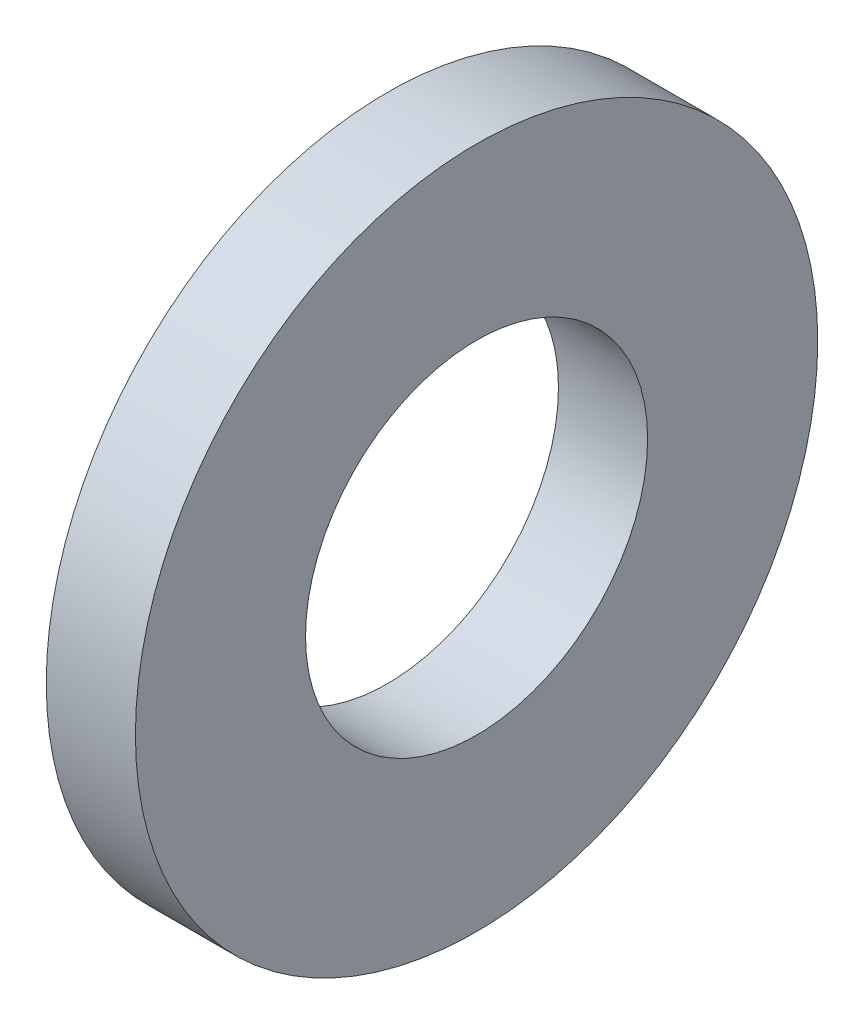
ISO-10303-21;
HEADER;
FILE_DESCRIPTION(('STEP AP214'),'2;1');
FILE_NAME('part.step','',(''),(''),'','','');
FILE_SCHEMA(('AUTOMOTIVE_DESIGN { 1 0 10303 214 1 1 1 1 }'));
ENDSEC;
DATA;
#1=APPLICATION_CONTEXT('core data for automotive mechanical design processes');
#2=APPLICATION_PROTOCOL_DEFINITION('international standard','automotive_design',2000,#1);
#3=PRODUCT_CONTEXT('',#1,'mechanical');
#4=PRODUCT('Part','Part','',(#3));
#5=PRODUCT_RELATED_PRODUCT_CATEGORY('part','',(#4));
#6=PRODUCT_DEFINITION_FORMATION('','',#4);
#7=PRODUCT_DEFINITION_CONTEXT('part definition',#1,'design');
#8=PRODUCT_DEFINITION('design','',#6,#7);
#9=PRODUCT_DEFINITION_SHAPE('','',#8);
#10=(LENGTH_UNIT() NAMED_UNIT(*) SI_UNIT(.MILLI.,.METRE.));
#11=(NAMED_UNIT(*) PLANE_ANGLE_UNIT() SI_UNIT($,.RADIAN.));
#12=(NAMED_UNIT(*) SI_UNIT($,.STERADIAN.) SOLID_ANGLE_UNIT());
#13=UNCERTAINTY_MEASURE_WITH_UNIT(LENGTH_MEASURE(1.E-05),#10,'distance_accuracy_value','');
#14=(GEOMETRIC_REPRESENTATION_CONTEXT(3) GLOBAL_UNCERTAINTY_ASSIGNED_CONTEXT((#13)) GLOBAL_UNIT_ASSIGNED_CONTEXT((#10,
#11,#12)) REPRESENTATION_CONTEXT('',''));
#15=CARTESIAN_POINT('',(0.,0.,0.));
#16=DIRECTION('',(0.,0.,1.));
#17=DIRECTION('',(1.,0.,0.));
#18=AXIS2_PLACEMENT_3D('',#15,#16,#17);
#19=CARTESIAN_POINT('',(-1.2446,2.38759999999999,0.));
#20=DIRECTION('',(-1.,0.,0.));
#21=DIRECTION('',(0.,0.,1.));
#22=AXIS2_PLACEMENT_3D('',#19,#20,#21);
#23=PLANE('',#22);
#24=CARTESIAN_POINT('',(-1.2446,0.,0.));
#25=DIRECTION('',(-1.,0.,0.));
#26=DIRECTION('',(0.,0.,1.));
#27=AXIS2_PLACEMENT_3D('',#24,#25,#26);
#28=CIRCLE('',#27,4.7625);
#29=CARTESIAN_POINT('',(-1.2446,0.,4.7625));
#30=VERTEX_POINT('',#29);
#31=EDGE_CURVE('E10',#30,#30,#28,.T.);
#32=ORIENTED_EDGE('',*,*,#31,.T.);
#33=EDGE_LOOP('',(#32));
#34=FACE_BOUND('',#33,.T.);
#35=CARTESIAN_POINT('',(-1.2446,0.,0.));
#36=DIRECTION('',(-1.,0.,0.));
#37=DIRECTION('',(0.,0.,1.));
#38=AXIS2_PLACEMENT_3D('',#35,#36,#37);
#39=CIRCLE('',#38,2.3876);
#40=CARTESIAN_POINT('',(-1.2446,0.,2.3876));
#41=VERTEX_POINT('',#40);
#42=EDGE_CURVE('E44',#41,#41,#39,.T.);
#43=ORIENTED_EDGE('',*,*,#42,.F.);
#44=EDGE_LOOP('',(#43));
#45=FACE_BOUND('',#44,.T.);
#46=ADVANCED_FACE('F30',(#34,#45),#23,.T.);
#47=CARTESIAN_POINT('',(0.,0.,0.));
#48=DIRECTION('',(-1.,0.,0.));
#49=DIRECTION('',(0.,0.,1.));
#50=AXIS2_PLACEMENT_3D('',#47,#48,#49);
#51=CYLINDRICAL_SURFACE('',#50,4.7625);
#52=CARTESIAN_POINT('',(0.,0.,0.));
#53=DIRECTION('',(-1.,0.,0.));
#54=DIRECTION('',(0.,0.,1.));
#55=AXIS2_PLACEMENT_3D('',#52,#53,#54);
#56=CIRCLE('',#55,4.7625);
#57=CARTESIAN_POINT('',(0.,0.,4.7625));
#58=VERTEX_POINT('',#57);
#59=EDGE_CURVE('E36',#58,#58,#56,.T.);
#60=ORIENTED_EDGE('',*,*,#59,.T.);
#61=EDGE_LOOP('',(#60));
#62=FACE_BOUND('',#61,.T.);
#63=ORIENTED_EDGE('',*,*,#31,.F.);
#64=EDGE_LOOP('',(#63));
#65=FACE_BOUND('',#64,.T.);
#66=ADVANCED_FACE('F54',(#62,#65),#51,.T.);
#67=CARTESIAN_POINT('',(0.,4.7625,0.));
#68=DIRECTION('',(1.,0.,0.));
#69=DIRECTION('',(0.,0.,-1.));
#70=AXIS2_PLACEMENT_3D('',#67,#68,#69);
#71=PLANE('',#70);
#72=CARTESIAN_POINT('',(0.,0.,0.));
#73=DIRECTION('',(-1.,0.,0.));
#74=DIRECTION('',(0.,0.,1.));
#75=AXIS2_PLACEMENT_3D('',#72,#73,#74);
#76=CIRCLE('',#75,2.3876);
#77=CARTESIAN_POINT('',(0.,0.,2.3876));
#78=VERTEX_POINT('',#77);
#79=EDGE_CURVE('E40',#78,#78,#76,.T.);
#80=ORIENTED_EDGE('',*,*,#79,.T.);
#81=EDGE_LOOP('',(#80));
#82=FACE_BOUND('',#81,.T.);
#83=ORIENTED_EDGE('',*,*,#59,.F.);
#84=EDGE_LOOP('',(#83));
#85=FACE_BOUND('',#84,.T.);
#86=ADVANCED_FACE('F58',(#82,#85),#71,.T.);
#87=CARTESIAN_POINT('',(0.,0.,0.));
#88=DIRECTION('',(-1.,0.,0.));
#89=DIRECTION('',(0.,0.,1.));
#90=AXIS2_PLACEMENT_3D('',#87,#88,#89);
#91=CYLINDRICAL_SURFACE('',#90,2.3876);
#92=ORIENTED_EDGE('',*,*,#42,.T.);
#93=EDGE_LOOP('',(#92));
#94=FACE_BOUND('',#93,.T.);
#95=ORIENTED_EDGE('',*,*,#79,.F.);
#96=EDGE_LOOP('',(#95));
#97=FACE_BOUND('',#96,.T.);
#98=ADVANCED_FACE('F50',(#94,#97),#91,.F.);
#99=CLOSED_SHELL('',(#46,#66,#86,#98));
#100=MANIFOLD_SOLID_BREP('B2',#99);
#101=ADVANCED_BREP_SHAPE_REPRESENTATION('',(#18,#100),#14);
#102=SHAPE_DEFINITION_REPRESENTATION(#9,#101);
ENDSEC;
END-ISO-10303-21;
